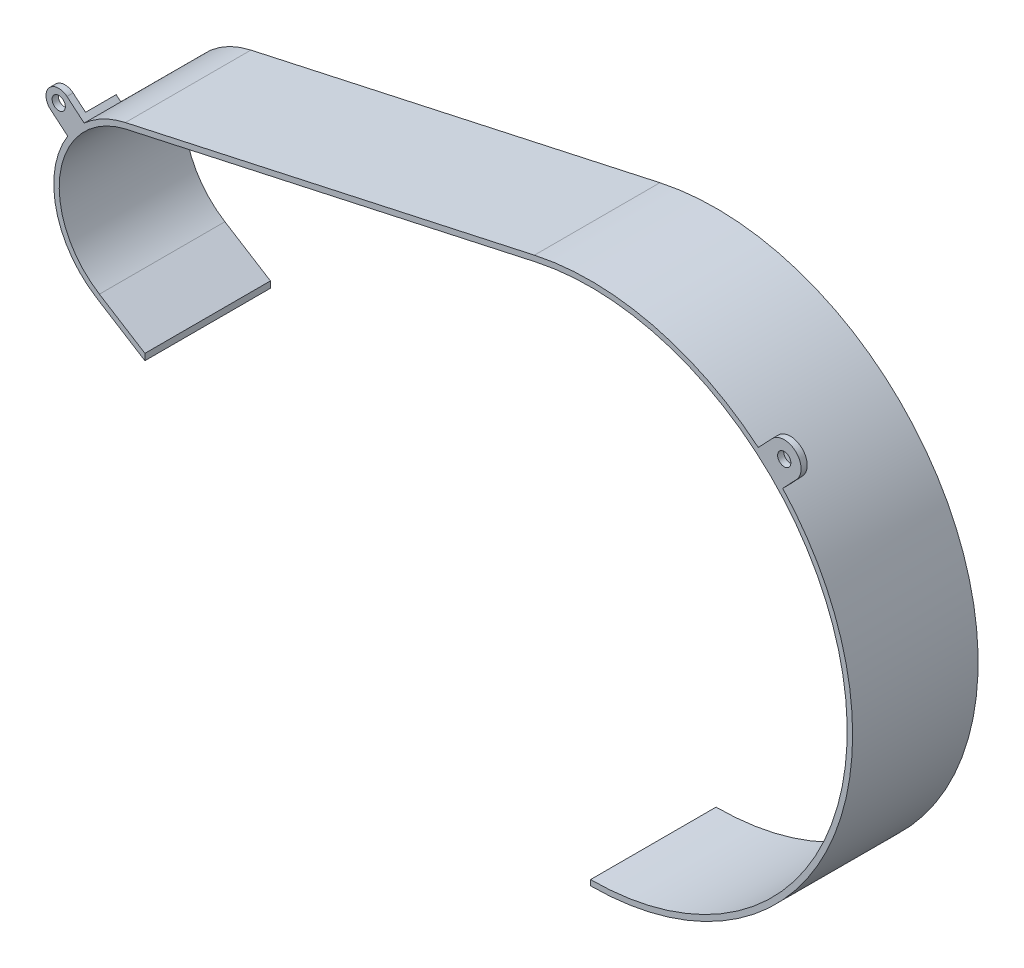
ISO-10303-21;
HEADER;
FILE_DESCRIPTION(('STEP AP214'),'2;1');
FILE_NAME('part.step','',(''),(''),'','','');
FILE_SCHEMA(('AUTOMOTIVE_DESIGN { 1 0 10303 214 1 1 1 1 }'));
ENDSEC;
DATA;
#1=APPLICATION_CONTEXT('core data for automotive mechanical design processes');
#2=APPLICATION_PROTOCOL_DEFINITION('international standard','automotive_design',2000,#1);
#3=PRODUCT_CONTEXT('',#1,'mechanical');
#4=PRODUCT('Part','Part','',(#3));
#5=PRODUCT_RELATED_PRODUCT_CATEGORY('part','',(#4));
#6=PRODUCT_DEFINITION_FORMATION('','',#4);
#7=PRODUCT_DEFINITION_CONTEXT('part definition',#1,'design');
#8=PRODUCT_DEFINITION('design','',#6,#7);
#9=PRODUCT_DEFINITION_SHAPE('','',#8);
#10=(LENGTH_UNIT() NAMED_UNIT(*) SI_UNIT(.MILLI.,.METRE.));
#11=(NAMED_UNIT(*) PLANE_ANGLE_UNIT() SI_UNIT($,.RADIAN.));
#12=(NAMED_UNIT(*) SI_UNIT($,.STERADIAN.) SOLID_ANGLE_UNIT());
#13=UNCERTAINTY_MEASURE_WITH_UNIT(LENGTH_MEASURE(1.E-05),#10,'distance_accuracy_value','');
#14=(GEOMETRIC_REPRESENTATION_CONTEXT(3) GLOBAL_UNCERTAINTY_ASSIGNED_CONTEXT((#13)) GLOBAL_UNIT_ASSIGNED_CONTEXT((#10,
#11,#12)) REPRESENTATION_CONTEXT('',''));
#15=CARTESIAN_POINT('',(0.,0.,0.));
#16=DIRECTION('',(0.,0.,1.));
#17=DIRECTION('',(1.,0.,0.));
#18=AXIS2_PLACEMENT_3D('',#15,#16,#17);
#19=CARTESIAN_POINT('',(-0.694427294768429,68.7178075815896,529.75642530509));
#20=DIRECTION('',(0.,0.,-1.));
#21=DIRECTION('',(-1.,0.,0.));
#22=AXIS2_PLACEMENT_3D('',#19,#20,#21);
#23=CYLINDRICAL_SURFACE('',#22,44.6599999999996);
#24=CARTESIAN_POINT('',(-0.694427294768429,68.7178075815896,43.5));
#25=DIRECTION('',(0.,0.,-1.));
#26=DIRECTION('',(-1.,0.,0.));
#27=AXIS2_PLACEMENT_3D('',#24,#25,#26);
#28=CIRCLE('',#27,44.6599999999996);
#29=CARTESIAN_POINT('',(-38.5377536434611,92.4327448757574,43.5));
#30=VERTEX_POINT('',#29);
#31=CARTESIAN_POINT('',(-30.4831205853251,101.991661461793,43.5));
#32=VERTEX_POINT('',#31);
#33=EDGE_CURVE('E11',#30,#32,#28,.T.);
#34=ORIENTED_EDGE('',*,*,#33,.T.);
#35=DIRECTION('',(0.,0.,1.));
#36=VECTOR('',#35,1.);
#37=CARTESIAN_POINT('',(-30.4831205853251,101.991661461793,58.5));
#38=LINE('',#37,#36);
#39=CARTESIAN_POINT('',(-30.4831205853251,101.991661461793,61.5));
#40=VERTEX_POINT('',#39);
#41=EDGE_CURVE('E255',#32,#40,#38,.T.);
#42=ORIENTED_EDGE('',*,*,#41,.T.);
#43=CARTESIAN_POINT('',(-0.694427294768429,68.7178075815896,61.5));
#44=DIRECTION('',(0.,0.,1.));
#45=DIRECTION('',(1.,0.,0.));
#46=AXIS2_PLACEMENT_3D('',#43,#44,#45);
#47=CIRCLE('',#46,44.6599999999996);
#48=CARTESIAN_POINT('',(-10.2551318378625,112.342439713446,61.5));
#49=VERTEX_POINT('',#48);
#50=EDGE_CURVE('E289',#49,#40,#47,.T.);
#51=ORIENTED_EDGE('',*,*,#50,.F.);
#52=DIRECTION('',(0.,0.,-1.));
#53=VECTOR('',#52,1.);
#54=CARTESIAN_POINT('',(-10.2551318378625,112.342439713446,529.75642530509));
#55=LINE('',#54,#53);
#56=CARTESIAN_POINT('',(-10.2551318378625,112.342439713446,0.));
#57=VERTEX_POINT('',#56);
#58=EDGE_CURVE('E330',#49,#57,#55,.T.);
#59=ORIENTED_EDGE('',*,*,#58,.T.);
#60=CARTESIAN_POINT('',(-0.694427294768429,68.7178075815896,0.));
#61=DIRECTION('',(0.,0.,1.));
#62=DIRECTION('',(1.,0.,0.));
#63=AXIS2_PLACEMENT_3D('',#60,#61,#62);
#64=CIRCLE('',#63,44.6599999999996);
#65=CARTESIAN_POINT('',(-24.4006210796191,30.8690034230026,0.));
#66=VERTEX_POINT('',#65);
#67=EDGE_CURVE('E322',#57,#66,#64,.T.);
#68=ORIENTED_EDGE('',*,*,#67,.T.);
#69=DIRECTION('',(0.,0.,-1.));
#70=VECTOR('',#69,1.);
#71=CARTESIAN_POINT('',(-24.4006210796191,30.8690034230026,529.75642530509));
#72=LINE('',#71,#70);
#73=CARTESIAN_POINT('',(-24.4006210796191,30.8690034230026,61.5));
#74=VERTEX_POINT('',#73);
#75=EDGE_CURVE('E328',#74,#66,#72,.T.);
#76=ORIENTED_EDGE('',*,*,#75,.F.);
#77=CARTESIAN_POINT('',(-38.5377536434611,92.4327448757574,61.5));
#78=VERTEX_POINT('',#77);
#79=EDGE_CURVE('E288',#78,#74,#47,.T.);
#80=ORIENTED_EDGE('',*,*,#79,.F.);
#81=DIRECTION('',(0.,0.,1.));
#82=VECTOR('',#81,1.);
#83=CARTESIAN_POINT('',(-38.5377536434611,92.4327448757574,58.5));
#84=LINE('',#83,#82);
#85=EDGE_CURVE('E258',#30,#78,#84,.T.);
#86=ORIENTED_EDGE('',*,*,#85,.F.);
#87=EDGE_LOOP('',(#34,#42,#51,#59,#68,#76,#80,#86));
#88=FACE_BOUND('',#87,.T.);
#89=ADVANCED_FACE('F37',(#88),#23,.T.);
#90=CARTESIAN_POINT('',(-42.9201771884048,104.298505240855,58.5));
#91=DIRECTION('',(0.,0.,-1.));
#92=DIRECTION('',(-1.,0.,0.));
#93=AXIS2_PLACEMENT_3D('',#90,#91,#92);
#94=PLANE('',#93);
#95=CARTESIAN_POINT('',(-42.9201771884048,104.298505240855,58.5));
#96=DIRECTION('',(0.,0.,1.));
#97=DIRECTION('',(1.,0.,0.));
#98=AXIS2_PLACEMENT_3D('',#95,#96,#97);
#99=CIRCLE('',#98,3.24999999999824);
#100=CARTESIAN_POINT('',(-39.6701771884066,104.298505240855,58.5));
#101=VERTEX_POINT('',#100);
#102=EDGE_CURVE('E230',#101,#101,#99,.T.);
#103=ORIENTED_EDGE('',*,*,#102,.T.);
#104=EDGE_LOOP('',(#103));
#105=FACE_BOUND('',#104,.T.);
#106=DIRECTION('',(-0.764713326882832,0.64437064465088,0.));
#107=VECTOR('',#106,1.);
#108=CARTESIAN_POINT('',(-38.8928606593368,109.077963533873,58.5));
#109=LINE('',#108,#107);
#110=CARTESIAN_POINT('',(-32.7772605659736,103.924773395745,58.5));
#111=VERTEX_POINT('',#110);
#112=CARTESIAN_POINT('',(-38.8928606593368,109.077963533873,58.5));
#113=VERTEX_POINT('',#112);
#114=EDGE_CURVE('E243',#111,#113,#109,.T.);
#115=ORIENTED_EDGE('',*,*,#114,.F.);
#116=DIRECTION('',(0.64437064465088,0.764713326882832,0.));
#117=VECTOR('',#116,1.);
#118=CARTESIAN_POINT('',(-32.7772605659736,103.924773395745,58.5));
#119=LINE('',#118,#117);
#120=CARTESIAN_POINT('',(-40.8318936241096,94.3658568097101,58.5));
#121=VERTEX_POINT('',#120);
#122=EDGE_CURVE('E212',#121,#111,#119,.T.);
#123=ORIENTED_EDGE('',*,*,#122,.F.);
#124=DIRECTION('',(0.764713326882832,-0.64437064465088,0.));
#125=VECTOR('',#124,1.);
#126=CARTESIAN_POINT('',(-46.9474937174728,99.5190469478378,58.5));
#127=LINE('',#126,#125);
#128=CARTESIAN_POINT('',(-46.9474937174728,99.5190469478378,58.5));
#129=VERTEX_POINT('',#128);
#130=EDGE_CURVE('E239',#129,#121,#127,.T.);
#131=ORIENTED_EDGE('',*,*,#130,.F.);
#132=CARTESIAN_POINT('',(-42.9201771884048,104.298505240855,58.5));
#133=DIRECTION('',(0.,0.,1.));
#134=DIRECTION('',(-1.,0.,0.));
#135=AXIS2_PLACEMENT_3D('',#132,#133,#134);
#136=CIRCLE('',#135,6.25);
#137=EDGE_CURVE('E236',#113,#129,#136,.T.);
#138=ORIENTED_EDGE('',*,*,#137,.F.);
#139=EDGE_LOOP('',(#115,#123,#131,#138));
#140=FACE_BOUND('',#139,.T.);
#141=ADVANCED_FACE('F392',(#105,#140),#94,.T.);
#142=CARTESIAN_POINT('',(-24.4006210796182,30.8690034230041,529.75642530509));
#143=DIRECTION('',(0.530814907856048,0.847487777845661,0.));
#144=DIRECTION('',(-0.84748777784566,0.530814907856048,0.));
#145=AXIS2_PLACEMENT_3D('',#142,#143,#144);
#146=PLANE('',#145);
#147=DIRECTION('',(0.,0.,-1.));
#148=VECTOR('',#147,1.);
#149=CARTESIAN_POINT('',(-0.694427294768426,16.020882425306,529.75642530509));
#150=LINE('',#149,#148);
#151=CARTESIAN_POINT('',(-0.694427294768425,16.020882425306,61.5));
#152=VERTEX_POINT('',#151);
#153=CARTESIAN_POINT('',(-0.694427294768425,16.020882425306,0.));
#154=VERTEX_POINT('',#153);
#155=EDGE_CURVE('E275',#152,#154,#150,.T.);
#156=ORIENTED_EDGE('',*,*,#155,.F.);
#157=DIRECTION('',(0.84748777784566,-0.530814907856048,0.));
#158=VECTOR('',#157,1.);
#159=CARTESIAN_POINT('',(-24.4006210796182,30.8690034230041,61.5));
#160=LINE('',#159,#158);
#161=EDGE_CURVE('E285',#74,#152,#160,.T.);
#162=ORIENTED_EDGE('',*,*,#161,.F.);
#163=ORIENTED_EDGE('',*,*,#75,.T.);
#164=DIRECTION('',(0.84748777784566,-0.530814907856048,0.));
#165=VECTOR('',#164,1.);
#166=CARTESIAN_POINT('',(-24.4006210796182,30.8690034230041,0.));
#167=LINE('',#166,#165);
#168=EDGE_CURVE('E325',#66,#154,#167,.T.);
#169=ORIENTED_EDGE('',*,*,#168,.T.);
#170=EDGE_LOOP('',(#156,#162,#163,#169));
#171=FACE_BOUND('',#170,.T.);
#172=ADVANCED_FACE('F398',(#171),#146,.F.);
#173=CARTESIAN_POINT('',(217.691145813398,30.8015134419438,0.));
#174=DIRECTION('',(0.,0.,1.));
#175=DIRECTION('',(1.,0.,0.));
#176=AXIS2_PLACEMENT_3D('',#173,#174,#175);
#177=PLANE('',#176);
#178=DIRECTION('',(0.,1.,0.));
#179=VECTOR('',#178,1.);
#180=CARTESIAN_POINT('',(-0.694427294768425,0.,0.));
#181=LINE('',#180,#179);
#182=CARTESIAN_POINT('',(-0.694427294768422,19.1595707574986,0.));
#183=VERTEX_POINT('',#182);
#184=EDGE_CURVE('E262',#154,#183,#181,.T.);
#185=ORIENTED_EDGE('',*,*,#184,.F.);
#186=ORIENTED_EDGE('',*,*,#168,.F.);
#187=ORIENTED_EDGE('',*,*,#67,.F.);
#188=DIRECTION('',(-0.976816662155274,-0.214077575976161,0.));
#189=VECTOR('',#188,1.);
#190=CARTESIAN_POINT('',(190.193154769985,156.272365325998,0.));
#191=LINE('',#190,#189);
#192=CARTESIAN_POINT('',(190.193154769985,156.272365325998,0.));
#193=VERTEX_POINT('',#192);
#194=EDGE_CURVE('E319',#193,#57,#191,.T.);
#195=ORIENTED_EDGE('',*,*,#194,.F.);
#196=CARTESIAN_POINT('',(217.691145813398,30.8015134419438,0.));
#197=DIRECTION('',(0.,0.,1.));
#198=DIRECTION('',(1.,0.,0.));
#199=AXIS2_PLACEMENT_3D('',#196,#197,#198);
#200=CIRCLE('',#199,128.448722001949);
#201=CARTESIAN_POINT('',(217.69114570248,-97.6472085600048,0.));
#202=VERTEX_POINT('',#201);
#203=EDGE_CURVE('E317',#202,#193,#200,.T.);
#204=ORIENTED_EDGE('',*,*,#203,.F.);
#205=DIRECTION('',(0.,1.,0.));
#206=VECTOR('',#205,1.);
#207=CARTESIAN_POINT('',(217.69114570248,0.,0.));
#208=LINE('',#207,#206);
#209=CARTESIAN_POINT('',(217.69114570248,-94.9872085600048,0.));
#210=VERTEX_POINT('',#209);
#211=EDGE_CURVE('E264',#202,#210,#208,.T.);
#212=ORIENTED_EDGE('',*,*,#211,.T.);
#213=CARTESIAN_POINT('',(217.691145813398,30.8015134419438,0.));
#214=DIRECTION('',(0.,0.,1.));
#215=DIRECTION('',(1.,0.,0.));
#216=AXIS2_PLACEMENT_3D('',#213,#214,#215);
#217=CIRCLE('',#216,125.788722001949);
#218=CARTESIAN_POINT('',(190.762601122082,153.674033004665,0.));
#219=VERTEX_POINT('',#218);
#220=EDGE_CURVE('E305',#210,#219,#217,.T.);
#221=ORIENTED_EDGE('',*,*,#220,.T.);
#222=DIRECTION('',(-0.976816662155274,-0.214077575976161,0.));
#223=VECTOR('',#222,1.);
#224=CARTESIAN_POINT('',(190.762601122082,153.674033004665,0.));
#225=LINE('',#224,#223);
#226=CARTESIAN_POINT('',(-9.68568548576584,109.744107392113,0.));
#227=VERTEX_POINT('',#226);
#228=EDGE_CURVE('E307',#219,#227,#225,.T.);
#229=ORIENTED_EDGE('',*,*,#228,.T.);
#230=CARTESIAN_POINT('',(-0.694427294768429,68.7178075815896,0.));
#231=DIRECTION('',(0.,0.,1.));
#232=DIRECTION('',(1.,0.,0.));
#233=AXIS2_PLACEMENT_3D('',#230,#231,#232);
#234=CIRCLE('',#233,41.9999999999996);
#235=CARTESIAN_POINT('',(-22.9886534247211,33.1233209120736,0.));
#236=VERTEX_POINT('',#235);
#237=EDGE_CURVE('E299',#227,#236,#234,.T.);
#238=ORIENTED_EDGE('',*,*,#237,.T.);
#239=DIRECTION('',(0.84748777784566,-0.530814907856048,0.));
#240=VECTOR('',#239,1.);
#241=CARTESIAN_POINT('',(-22.9886534247211,33.1233209120736,0.));
#242=LINE('',#241,#240);
#243=EDGE_CURVE('E302',#236,#183,#242,.T.);
#244=ORIENTED_EDGE('',*,*,#243,.T.);
#245=EDGE_LOOP('',(#185,#186,#187,#195,#204,#212,#221,#229,#238,#244));
#246=FACE_BOUND('',#245,.T.);
#247=ADVANCED_FACE('F368',(#246),#177,.F.);
#248=CARTESIAN_POINT('',(-22.9886534247211,33.1233209120736,529.75642530509));
#249=DIRECTION('',(0.530814907856048,0.84748777784566,0.));
#250=DIRECTION('',(-0.84748777784566,0.530814907856048,0.));
#251=AXIS2_PLACEMENT_3D('',#248,#249,#250);
#252=PLANE('',#251);
#253=DIRECTION('',(0.84748777784566,-0.530814907856048,0.));
#254=VECTOR('',#253,1.);
#255=CARTESIAN_POINT('',(-22.9886534247211,33.1233209120736,61.5));
#256=LINE('',#255,#254);
#257=CARTESIAN_POINT('',(-22.9886534247211,33.1233209120736,61.5));
#258=VERTEX_POINT('',#257);
#259=CARTESIAN_POINT('',(-0.694427294768425,19.1595707574986,61.5));
#260=VERTEX_POINT('',#259);
#261=EDGE_CURVE('E279',#258,#260,#256,.T.);
#262=ORIENTED_EDGE('',*,*,#261,.T.);
#263=DIRECTION('',(0.,0.,-1.));
#264=VECTOR('',#263,1.);
#265=CARTESIAN_POINT('',(-0.694427294768426,19.1595707574986,529.75642530509));
#266=LINE('',#265,#264);
#267=EDGE_CURVE('E272',#260,#183,#266,.T.);
#268=ORIENTED_EDGE('',*,*,#267,.T.);
#269=ORIENTED_EDGE('',*,*,#243,.F.);
#270=DIRECTION('',(0.,0.,-1.));
#271=VECTOR('',#270,1.);
#272=CARTESIAN_POINT('',(-22.9886534247211,33.1233209120736,529.75642530509));
#273=LINE('',#272,#271);
#274=EDGE_CURVE('E315',#258,#236,#273,.T.);
#275=ORIENTED_EDGE('',*,*,#274,.F.);
#276=EDGE_LOOP('',(#262,#268,#269,#275));
#277=FACE_BOUND('',#276,.T.);
#278=ADVANCED_FACE('F345',(#277),#252,.T.);
#279=CARTESIAN_POINT('',(0.,0.,61.5));
#280=DIRECTION('',(0.,0.,1.));
#281=DIRECTION('',(1.,0.,0.));
#282=AXIS2_PLACEMENT_3D('',#279,#280,#281);
#283=PLANE('',#282);
#284=ORIENTED_EDGE('',*,*,#161,.T.);
#285=DIRECTION('',(0.,1.,0.));
#286=VECTOR('',#285,1.);
#287=CARTESIAN_POINT('',(-0.694427294768425,0.,61.5));
#288=LINE('',#287,#286);
#289=EDGE_CURVE('E45',#152,#260,#288,.T.);
#290=ORIENTED_EDGE('',*,*,#289,.T.);
#291=ORIENTED_EDGE('',*,*,#261,.F.);
#292=CARTESIAN_POINT('',(-0.694427294768429,68.7178075815896,61.5));
#293=DIRECTION('',(0.,0.,1.));
#294=DIRECTION('',(1.,0.,0.));
#295=AXIS2_PLACEMENT_3D('',#292,#293,#294);
#296=CIRCLE('',#295,41.9999999999996);
#297=CARTESIAN_POINT('',(-9.68568548576584,109.744107392113,61.5));
#298=VERTEX_POINT('',#297);
#299=EDGE_CURVE('E282',#298,#258,#296,.T.);
#300=ORIENTED_EDGE('',*,*,#299,.F.);
#301=DIRECTION('',(-0.976816662155274,-0.214077575976161,0.));
#302=VECTOR('',#301,1.);
#303=CARTESIAN_POINT('',(190.762601122082,153.674033004665,61.5));
#304=LINE('',#303,#302);
#305=CARTESIAN_POINT('',(190.762601122082,153.674033004665,61.5));
#306=VERTEX_POINT('',#305);
#307=EDGE_CURVE('E335',#306,#298,#304,.T.);
#308=ORIENTED_EDGE('',*,*,#307,.F.);
#309=CARTESIAN_POINT('',(217.691145813398,30.8015134419438,61.5));
#310=DIRECTION('',(0.,0.,1.));
#311=DIRECTION('',(1.,0.,0.));
#312=AXIS2_PLACEMENT_3D('',#309,#310,#311);
#313=CIRCLE('',#312,125.788722001949);
#314=CARTESIAN_POINT('',(217.69114570248,-94.9872085600048,61.5));
#315=VERTEX_POINT('',#314);
#316=EDGE_CURVE('E277',#315,#306,#313,.T.);
#317=ORIENTED_EDGE('',*,*,#316,.F.);
#318=DIRECTION('',(0.,1.,0.));
#319=VECTOR('',#318,1.);
#320=CARTESIAN_POINT('',(217.69114570248,0.,61.5));
#321=LINE('',#320,#319);
#322=CARTESIAN_POINT('',(217.691145813398,-97.6472085600048,61.5));
#323=VERTEX_POINT('',#322);
#324=EDGE_CURVE('E254',#323,#315,#321,.T.);
#325=ORIENTED_EDGE('',*,*,#324,.F.);
#326=CARTESIAN_POINT('',(217.691145813398,30.8015134419438,61.5));
#327=DIRECTION('',(0.,0.,1.));
#328=DIRECTION('',(1.,0.,0.));
#329=AXIS2_PLACEMENT_3D('',#326,#327,#328);
#330=CIRCLE('',#329,128.448722001949);
#331=CARTESIAN_POINT('',(311.872256696592,118.145617631874,61.5));
#332=VERTEX_POINT('',#331);
#333=EDGE_CURVE('E296',#323,#332,#330,.T.);
#334=ORIENTED_EDGE('',*,*,#333,.T.);
#335=DIRECTION('',(0.688031108885611,0.725681192539559,0.));
#336=VECTOR('',#335,1.);
#337=CARTESIAN_POINT('',(318.602174778539,125.243806821766,61.5));
#338=LINE('',#337,#336);
#339=CARTESIAN_POINT('',(318.602174778539,125.243806821766,61.5));
#340=VERTEX_POINT('',#339);
#341=EDGE_CURVE('E197',#332,#340,#338,.T.);
#342=ORIENTED_EDGE('',*,*,#341,.T.);
#343=CARTESIAN_POINT('',(312.615304940089,130.920063470071,61.5));
#344=DIRECTION('',(0.,0.,1.));
#345=DIRECTION('',(-1.,0.,0.));
#346=AXIS2_PLACEMENT_3D('',#343,#344,#345);
#347=CIRCLE('',#346,8.24999999999829);
#348=CARTESIAN_POINT('',(306.628435101639,136.596320118376,61.5));
#349=VERTEX_POINT('',#348);
#350=EDGE_CURVE('E207',#340,#349,#347,.T.);
#351=ORIENTED_EDGE('',*,*,#350,.T.);
#352=DIRECTION('',(-0.688031108885604,-0.725681192539565,0.));
#353=VECTOR('',#352,1.);
#354=CARTESIAN_POINT('',(306.628435101639,136.596320118376,61.5));
#355=LINE('',#354,#353);
#356=CARTESIAN_POINT('',(299.898517019691,129.498130928485,61.5));
#357=VERTEX_POINT('',#356);
#358=EDGE_CURVE('E52',#349,#357,#355,.T.);
#359=ORIENTED_EDGE('',*,*,#358,.T.);
#360=CARTESIAN_POINT('',(190.193154769985,156.272365325998,61.5));
#361=VERTEX_POINT('',#360);
#362=EDGE_CURVE('E295',#357,#361,#330,.T.);
#363=ORIENTED_EDGE('',*,*,#362,.T.);
#364=DIRECTION('',(-0.976816662155274,-0.214077575976161,0.));
#365=VECTOR('',#364,1.);
#366=CARTESIAN_POINT('',(190.193154769985,156.272365325998,61.5));
#367=LINE('',#366,#365);
#368=EDGE_CURVE('E292',#361,#49,#367,.T.);
#369=ORIENTED_EDGE('',*,*,#368,.T.);
#370=ORIENTED_EDGE('',*,*,#50,.T.);
#371=DIRECTION('',(-0.764713326882832,0.64437064465088,0.));
#372=VECTOR('',#371,1.);
#373=CARTESIAN_POINT('',(-38.8928606593368,109.077963533873,61.5));
#374=LINE('',#373,#372);
#375=CARTESIAN_POINT('',(-38.8928606593368,109.077963533873,61.5));
#376=VERTEX_POINT('',#375);
#377=EDGE_CURVE('E240',#40,#376,#374,.T.);
#378=ORIENTED_EDGE('',*,*,#377,.T.);
#379=CARTESIAN_POINT('',(-42.9201771884048,104.298505240855,61.5));
#380=DIRECTION('',(0.,0.,1.));
#381=DIRECTION('',(-1.,0.,0.));
#382=AXIS2_PLACEMENT_3D('',#379,#380,#381);
#383=CIRCLE('',#382,6.25);
#384=CARTESIAN_POINT('',(-46.9474937174728,99.5190469478378,61.5));
#385=VERTEX_POINT('',#384);
#386=EDGE_CURVE('E233',#376,#385,#383,.T.);
#387=ORIENTED_EDGE('',*,*,#386,.T.);
#388=DIRECTION('',(0.764713326882832,-0.64437064465088,0.));
#389=VECTOR('',#388,1.);
#390=CARTESIAN_POINT('',(-46.9474937174728,99.5190469478378,61.5));
#391=LINE('',#390,#389);
#392=EDGE_CURVE('E248',#385,#78,#391,.T.);
#393=ORIENTED_EDGE('',*,*,#392,.T.);
#394=ORIENTED_EDGE('',*,*,#79,.T.);
#395=EDGE_LOOP('',(#284,#290,#291,#300,#308,#317,#325,#334,#342,#351,#359,#363,#369,#370,#378,
#387,#393,#394));
#396=FACE_BOUND('',#395,.T.);
#397=CARTESIAN_POINT('',(-42.9201771884048,104.298505240855,61.5));
#398=DIRECTION('',(0.,0.,1.));
#399=DIRECTION('',(1.,0.,0.));
#400=AXIS2_PLACEMENT_3D('',#397,#398,#399);
#401=CIRCLE('',#400,3.24999999999824);
#402=CARTESIAN_POINT('',(-39.6701771884066,104.298505240855,61.5));
#403=VERTEX_POINT('',#402);
#404=EDGE_CURVE('E229',#403,#403,#401,.T.);
#405=ORIENTED_EDGE('',*,*,#404,.F.);
#406=EDGE_LOOP('',(#405));
#407=FACE_BOUND('',#406,.T.);
#408=CARTESIAN_POINT('',(312.615304940089,130.920063470071,61.5));
#409=DIRECTION('',(0.,0.,1.));
#410=DIRECTION('',(1.,0.,0.));
#411=AXIS2_PLACEMENT_3D('',#408,#409,#410);
#412=CIRCLE('',#411,3.24999999999827);
#413=CARTESIAN_POINT('',(315.865304940087,130.920063470071,61.5));
#414=VERTEX_POINT('',#413);
#415=EDGE_CURVE('E202',#414,#414,#412,.T.);
#416=ORIENTED_EDGE('',*,*,#415,.F.);
#417=EDGE_LOOP('',(#416));
#418=FACE_BOUND('',#417,.T.);
#419=ADVANCED_FACE('F338',(#396,#407,#418),#283,.T.);
#420=CARTESIAN_POINT('',(190.193154769985,156.272365325998,529.75642530509));
#421=DIRECTION('',(0.214077575976161,-0.976816662155274,0.));
#422=DIRECTION('',(0.976816662155274,0.214077575976161,0.));
#423=AXIS2_PLACEMENT_3D('',#420,#421,#422);
#424=PLANE('',#423);
#425=ORIENTED_EDGE('',*,*,#368,.F.);
#426=DIRECTION('',(0.,0.,-1.));
#427=VECTOR('',#426,1.);
#428=CARTESIAN_POINT('',(190.193154769985,156.272365325998,529.75642530509));
#429=LINE('',#428,#427);
#430=EDGE_CURVE('E332',#361,#193,#429,.T.);
#431=ORIENTED_EDGE('',*,*,#430,.T.);
#432=ORIENTED_EDGE('',*,*,#194,.T.);
#433=ORIENTED_EDGE('',*,*,#58,.F.);
#434=EDGE_LOOP('',(#425,#431,#432,#433));
#435=FACE_BOUND('',#434,.T.);
#436=ADVANCED_FACE('F377',(#435),#424,.F.);
#437=CARTESIAN_POINT('',(217.691145813398,30.8015134419438,529.75642530509));
#438=DIRECTION('',(0.,0.,-1.));
#439=DIRECTION('',(-1.,0.,0.));
#440=AXIS2_PLACEMENT_3D('',#437,#438,#439);
#441=CYLINDRICAL_SURFACE('',#440,128.448722001949);
#442=CARTESIAN_POINT('',(217.691145813398,30.8015134419438,58.5));
#443=DIRECTION('',(0.,0.,-1.));
#444=DIRECTION('',(-1.,0.,0.));
#445=AXIS2_PLACEMENT_3D('',#442,#443,#444);
#446=CIRCLE('',#445,128.448722001949);
#447=CARTESIAN_POINT('',(299.898517019691,129.498130928485,58.5));
#448=VERTEX_POINT('',#447);
#449=CARTESIAN_POINT('',(311.872256696592,118.145617631874,58.5));
#450=VERTEX_POINT('',#449);
#451=EDGE_CURVE('E193',#448,#450,#446,.T.);
#452=ORIENTED_EDGE('',*,*,#451,.T.);
#453=DIRECTION('',(0.,0.,1.));
#454=VECTOR('',#453,1.);
#455=CARTESIAN_POINT('',(311.872256696592,118.145617631874,58.5));
#456=LINE('',#455,#454);
#457=EDGE_CURVE('E213',#450,#332,#456,.T.);
#458=ORIENTED_EDGE('',*,*,#457,.T.);
#459=ORIENTED_EDGE('',*,*,#333,.F.);
#460=DIRECTION('',(0.,0.,1.));
#461=VECTOR('',#460,1.);
#462=CARTESIAN_POINT('',(217.69114570248,-97.6472085600048,0.));
#463=LINE('',#462,#461);
#464=EDGE_CURVE('E267',#202,#323,#463,.T.);
#465=ORIENTED_EDGE('',*,*,#464,.F.);
#466=ORIENTED_EDGE('',*,*,#203,.T.);
#467=ORIENTED_EDGE('',*,*,#430,.F.);
#468=ORIENTED_EDGE('',*,*,#362,.F.);
#469=DIRECTION('',(0.,0.,1.));
#470=VECTOR('',#469,1.);
#471=CARTESIAN_POINT('',(299.898517019691,129.498130928485,58.5));
#472=LINE('',#471,#470);
#473=EDGE_CURVE('E183',#448,#357,#472,.T.);
#474=ORIENTED_EDGE('',*,*,#473,.F.);
#475=EDGE_LOOP('',(#452,#458,#459,#465,#466,#467,#468,#474));
#476=FACE_BOUND('',#475,.T.);
#477=ADVANCED_FACE('F39',(#476),#441,.T.);
#478=CARTESIAN_POINT('',(190.762601122082,153.674033004665,529.75642530509));
#479=DIRECTION('',(0.214077575976161,-0.976816662155274,0.));
#480=DIRECTION('',(0.976816662155274,0.214077575976161,0.));
#481=AXIS2_PLACEMENT_3D('',#478,#479,#480);
#482=PLANE('',#481);
#483=DIRECTION('',(0.,0.,-1.));
#484=VECTOR('',#483,1.);
#485=CARTESIAN_POINT('',(190.762601122082,153.674033004665,529.75642530509));
#486=LINE('',#485,#484);
#487=EDGE_CURVE('E312',#306,#219,#486,.T.);
#488=ORIENTED_EDGE('',*,*,#487,.F.);
#489=ORIENTED_EDGE('',*,*,#307,.T.);
#490=DIRECTION('',(0.,0.,-1.));
#491=VECTOR('',#490,1.);
#492=CARTESIAN_POINT('',(-9.68568548576584,109.744107392113,529.75642530509));
#493=LINE('',#492,#491);
#494=EDGE_CURVE('E310',#298,#227,#493,.T.);
#495=ORIENTED_EDGE('',*,*,#494,.T.);
#496=ORIENTED_EDGE('',*,*,#228,.F.);
#497=EDGE_LOOP('',(#488,#489,#495,#496));
#498=FACE_BOUND('',#497,.T.);
#499=ADVANCED_FACE('F357',(#498),#482,.T.);
#500=CARTESIAN_POINT('',(217.691145813398,30.8015134419438,529.75642530509));
#501=DIRECTION('',(0.,0.,-1.));
#502=DIRECTION('',(-1.,0.,0.));
#503=AXIS2_PLACEMENT_3D('',#500,#501,#502);
#504=CYLINDRICAL_SURFACE('',#503,125.788722001949);
#505=DIRECTION('',(0.,0.,-1.));
#506=VECTOR('',#505,1.);
#507=CARTESIAN_POINT('',(217.69114570248,-94.9872085600048,529.75642530509));
#508=LINE('',#507,#506);
#509=EDGE_CURVE('E270',#315,#210,#508,.T.);
#510=ORIENTED_EDGE('',*,*,#509,.F.);
#511=ORIENTED_EDGE('',*,*,#316,.T.);
#512=ORIENTED_EDGE('',*,*,#487,.T.);
#513=ORIENTED_EDGE('',*,*,#220,.F.);
#514=EDGE_LOOP('',(#510,#511,#512,#513));
#515=FACE_BOUND('',#514,.T.);
#516=ADVANCED_FACE('F361',(#515),#504,.F.);
#517=CARTESIAN_POINT('',(-0.694427294768429,68.7178075815896,529.75642530509));
#518=DIRECTION('',(0.,0.,-1.));
#519=DIRECTION('',(-1.,0.,0.));
#520=AXIS2_PLACEMENT_3D('',#517,#518,#519);
#521=CYLINDRICAL_SURFACE('',#520,41.9999999999996);
#522=ORIENTED_EDGE('',*,*,#494,.F.);
#523=ORIENTED_EDGE('',*,*,#299,.T.);
#524=ORIENTED_EDGE('',*,*,#274,.T.);
#525=ORIENTED_EDGE('',*,*,#237,.F.);
#526=EDGE_LOOP('',(#522,#523,#524,#525));
#527=FACE_BOUND('',#526,.T.);
#528=ADVANCED_FACE('F350',(#527),#521,.F.);
#529=CARTESIAN_POINT('',(217.69114570248,0.,0.));
#530=DIRECTION('',(1.,0.,0.));
#531=DIRECTION('',(0.,0.,-1.));
#532=AXIS2_PLACEMENT_3D('',#529,#530,#531);
#533=PLANE('',#532);
#534=ORIENTED_EDGE('',*,*,#509,.T.);
#535=ORIENTED_EDGE('',*,*,#211,.F.);
#536=ORIENTED_EDGE('',*,*,#464,.T.);
#537=ORIENTED_EDGE('',*,*,#324,.T.);
#538=EDGE_LOOP('',(#534,#535,#536,#537));
#539=FACE_BOUND('',#538,.T.);
#540=ADVANCED_FACE('F363',(#539),#533,.F.);
#541=CARTESIAN_POINT('',(-0.694427294768425,0.,0.));
#542=DIRECTION('',(1.,0.,0.));
#543=DIRECTION('',(0.,1.,0.));
#544=AXIS2_PLACEMENT_3D('',#541,#542,#543);
#545=PLANE('',#544);
#546=ORIENTED_EDGE('',*,*,#155,.T.);
#547=ORIENTED_EDGE('',*,*,#184,.T.);
#548=ORIENTED_EDGE('',*,*,#267,.F.);
#549=ORIENTED_EDGE('',*,*,#289,.F.);
#550=EDGE_LOOP('',(#546,#547,#548,#549));
#551=FACE_BOUND('',#550,.T.);
#552=ADVANCED_FACE('F415',(#551),#545,.T.);
#553=CARTESIAN_POINT('',(-42.9201771884048,104.298505240855,58.5));
#554=DIRECTION('',(0.,0.,1.));
#555=DIRECTION('',(1.,0.,0.));
#556=AXIS2_PLACEMENT_3D('',#553,#554,#555);
#557=CYLINDRICAL_SURFACE('',#556,6.25);
#558=ORIENTED_EDGE('',*,*,#386,.F.);
#559=DIRECTION('',(0.,0.,1.));
#560=VECTOR('',#559,1.);
#561=CARTESIAN_POINT('',(-38.8928606593368,109.077963533873,58.5));
#562=LINE('',#561,#560);
#563=EDGE_CURVE('E252',#113,#376,#562,.T.);
#564=ORIENTED_EDGE('',*,*,#563,.F.);
#565=ORIENTED_EDGE('',*,*,#137,.T.);
#566=DIRECTION('',(0.,0.,1.));
#567=VECTOR('',#566,1.);
#568=CARTESIAN_POINT('',(-46.9474937174728,99.5190469478378,58.5));
#569=LINE('',#568,#567);
#570=EDGE_CURVE('E245',#129,#385,#569,.T.);
#571=ORIENTED_EDGE('',*,*,#570,.T.);
#572=EDGE_LOOP('',(#558,#564,#565,#571));
#573=FACE_BOUND('',#572,.T.);
#574=ADVANCED_FACE('F447',(#573),#557,.T.);
#575=CARTESIAN_POINT('',(-38.8928606593368,109.077963533873,58.5));
#576=DIRECTION('',(0.64437064465088,0.764713326882832,0.));
#577=DIRECTION('',(-0.764713326882832,0.644370644650881,0.));
#578=AXIS2_PLACEMENT_3D('',#575,#576,#577);
#579=PLANE('',#578);
#580=ORIENTED_EDGE('',*,*,#377,.F.);
#581=ORIENTED_EDGE('',*,*,#41,.F.);
#582=DIRECTION('',(0.764713326882832,-0.64437064465088,0.));
#583=VECTOR('',#582,1.);
#584=CARTESIAN_POINT('',(-32.7772605659736,103.924773395745,43.5));
#585=LINE('',#584,#583);
#586=CARTESIAN_POINT('',(-32.7772605659736,103.924773395745,43.5));
#587=VERTEX_POINT('',#586);
#588=EDGE_CURVE('E217',#587,#32,#585,.T.);
#589=ORIENTED_EDGE('',*,*,#588,.F.);
#590=DIRECTION('',(0.,0.,1.));
#591=VECTOR('',#590,1.);
#592=CARTESIAN_POINT('',(-32.7772605659736,103.924773395745,43.5));
#593=LINE('',#592,#591);
#594=EDGE_CURVE('E224',#587,#111,#593,.T.);
#595=ORIENTED_EDGE('',*,*,#594,.T.);
#596=ORIENTED_EDGE('',*,*,#114,.T.);
#597=ORIENTED_EDGE('',*,*,#563,.T.);
#598=EDGE_LOOP('',(#580,#581,#589,#595,#596,#597));
#599=FACE_BOUND('',#598,.T.);
#600=ADVANCED_FACE('F435',(#599),#579,.T.);
#601=CARTESIAN_POINT('',(-46.9474937174728,99.5190469478378,58.5));
#602=DIRECTION('',(-0.64437064465088,-0.764713326882832,0.));
#603=DIRECTION('',(0.764713326882832,-0.64437064465088,0.));
#604=AXIS2_PLACEMENT_3D('',#601,#602,#603);
#605=PLANE('',#604);
#606=ORIENTED_EDGE('',*,*,#392,.F.);
#607=ORIENTED_EDGE('',*,*,#570,.F.);
#608=ORIENTED_EDGE('',*,*,#130,.T.);
#609=DIRECTION('',(0.,0.,1.));
#610=VECTOR('',#609,1.);
#611=CARTESIAN_POINT('',(-40.8318936241096,94.3658568097101,43.5));
#612=LINE('',#611,#610);
#613=CARTESIAN_POINT('',(-40.8318936241096,94.3658568097101,43.5));
#614=VERTEX_POINT('',#613);
#615=EDGE_CURVE('E60',#614,#121,#612,.T.);
#616=ORIENTED_EDGE('',*,*,#615,.F.);
#617=DIRECTION('',(-0.764713326882831,0.644370644650881,0.));
#618=VECTOR('',#617,1.);
#619=CARTESIAN_POINT('',(-38.5377536434611,92.4327448757574,43.5));
#620=LINE('',#619,#618);
#621=EDGE_CURVE('E220',#30,#614,#620,.T.);
#622=ORIENTED_EDGE('',*,*,#621,.F.);
#623=ORIENTED_EDGE('',*,*,#85,.T.);
#624=EDGE_LOOP('',(#606,#607,#608,#616,#622,#623));
#625=FACE_BOUND('',#624,.T.);
#626=ADVANCED_FACE('F450',(#625),#605,.T.);
#627=CARTESIAN_POINT('',(-42.9201771884048,104.298505240855,58.5));
#628=DIRECTION('',(0.,0.,1.));
#629=DIRECTION('',(1.,0.,0.));
#630=AXIS2_PLACEMENT_3D('',#627,#628,#629);
#631=CYLINDRICAL_SURFACE('',#630,3.24999999999824);
#632=ORIENTED_EDGE('',*,*,#102,.F.);
#633=EDGE_LOOP('',(#632));
#634=FACE_BOUND('',#633,.T.);
#635=ORIENTED_EDGE('',*,*,#404,.T.);
#636=EDGE_LOOP('',(#635));
#637=FACE_BOUND('',#636,.T.);
#638=ADVANCED_FACE('F452',(#634,#637),#631,.F.);
#639=CARTESIAN_POINT('',(-32.7772605659736,103.924773395745,43.5));
#640=DIRECTION('',(0.764713326882832,-0.64437064465088,0.));
#641=DIRECTION('',(0.64437064465088,0.764713326882832,0.));
#642=AXIS2_PLACEMENT_3D('',#639,#640,#641);
#643=PLANE('',#642);
#644=ORIENTED_EDGE('',*,*,#122,.T.);
#645=ORIENTED_EDGE('',*,*,#594,.F.);
#646=DIRECTION('',(0.64437064465088,0.764713326882832,0.));
#647=VECTOR('',#646,1.);
#648=CARTESIAN_POINT('',(-32.7772605659736,103.924773395745,43.5));
#649=LINE('',#648,#647);
#650=EDGE_CURVE('E222',#614,#587,#649,.T.);
#651=ORIENTED_EDGE('',*,*,#650,.F.);
#652=ORIENTED_EDGE('',*,*,#615,.T.);
#653=EDGE_LOOP('',(#644,#645,#651,#652));
#654=FACE_BOUND('',#653,.T.);
#655=ADVANCED_FACE('F439',(#654),#643,.F.);
#656=CARTESIAN_POINT('',(0.,0.,43.5));
#657=DIRECTION('',(0.,0.,-1.));
#658=DIRECTION('',(-1.,0.,0.));
#659=AXIS2_PLACEMENT_3D('',#656,#657,#658);
#660=PLANE('',#659);
#661=ORIENTED_EDGE('',*,*,#33,.F.);
#662=ORIENTED_EDGE('',*,*,#621,.T.);
#663=ORIENTED_EDGE('',*,*,#650,.T.);
#664=ORIENTED_EDGE('',*,*,#588,.T.);
#665=EDGE_LOOP('',(#661,#662,#663,#664));
#666=FACE_BOUND('',#665,.T.);
#667=ADVANCED_FACE('F388',(#666),#660,.T.);
#668=CARTESIAN_POINT('',(312.615304940089,130.920063470071,58.5));
#669=DIRECTION('',(0.,0.,1.));
#670=DIRECTION('',(1.,0.,0.));
#671=AXIS2_PLACEMENT_3D('',#668,#669,#670);
#672=CYLINDRICAL_SURFACE('',#671,8.24999999999829);
#673=ORIENTED_EDGE('',*,*,#350,.F.);
#674=DIRECTION('',(0.,0.,1.));
#675=VECTOR('',#674,1.);
#676=CARTESIAN_POINT('',(318.602174778539,125.243806821766,58.5));
#677=LINE('',#676,#675);
#678=CARTESIAN_POINT('',(318.602174778539,125.243806821766,58.5));
#679=VERTEX_POINT('',#678);
#680=EDGE_CURVE('E196',#679,#340,#677,.T.);
#681=ORIENTED_EDGE('',*,*,#680,.F.);
#682=CARTESIAN_POINT('',(312.615304940089,130.920063470071,58.5));
#683=DIRECTION('',(0.,0.,1.));
#684=DIRECTION('',(-1.,0.,0.));
#685=AXIS2_PLACEMENT_3D('',#682,#683,#684);
#686=CIRCLE('',#685,8.24999999999829);
#687=CARTESIAN_POINT('',(306.628435101639,136.596320118376,58.5));
#688=VERTEX_POINT('',#687);
#689=EDGE_CURVE('E190',#679,#688,#686,.T.);
#690=ORIENTED_EDGE('',*,*,#689,.T.);
#691=DIRECTION('',(0.,0.,1.));
#692=VECTOR('',#691,1.);
#693=CARTESIAN_POINT('',(306.628435101639,136.596320118376,58.5));
#694=LINE('',#693,#692);
#695=EDGE_CURVE('E175',#688,#349,#694,.T.);
#696=ORIENTED_EDGE('',*,*,#695,.T.);
#697=EDGE_LOOP('',(#673,#681,#690,#696));
#698=FACE_BOUND('',#697,.T.);
#699=ADVANCED_FACE('F195',(#698),#672,.T.);
#700=CARTESIAN_POINT('',(318.602174778539,125.243806821766,58.5));
#701=DIRECTION('',(0.725681192539559,-0.688031108885611,0.));
#702=DIRECTION('',(0.688031108885611,0.725681192539559,0.));
#703=AXIS2_PLACEMENT_3D('',#700,#701,#702);
#704=PLANE('',#703);
#705=ORIENTED_EDGE('',*,*,#341,.F.);
#706=ORIENTED_EDGE('',*,*,#457,.F.);
#707=DIRECTION('',(0.688031108885611,0.725681192539559,0.));
#708=VECTOR('',#707,1.);
#709=CARTESIAN_POINT('',(318.602174778539,125.243806821766,58.5));
#710=LINE('',#709,#708);
#711=EDGE_CURVE('E184',#450,#679,#710,.T.);
#712=ORIENTED_EDGE('',*,*,#711,.T.);
#713=ORIENTED_EDGE('',*,*,#680,.T.);
#714=EDGE_LOOP('',(#705,#706,#712,#713));
#715=FACE_BOUND('',#714,.T.);
#716=ADVANCED_FACE('F380',(#715),#704,.T.);
#717=CARTESIAN_POINT('',(306.628435101639,136.596320118376,58.5));
#718=DIRECTION('',(-0.725681192539565,0.688031108885604,0.));
#719=DIRECTION('',(-0.688031108885605,-0.725681192539565,0.));
#720=AXIS2_PLACEMENT_3D('',#717,#718,#719);
#721=PLANE('',#720);
#722=ORIENTED_EDGE('',*,*,#358,.F.);
#723=ORIENTED_EDGE('',*,*,#695,.F.);
#724=DIRECTION('',(-0.688031108885604,-0.725681192539565,0.));
#725=VECTOR('',#724,1.);
#726=CARTESIAN_POINT('',(306.628435101639,136.596320118376,58.5));
#727=LINE('',#726,#725);
#728=EDGE_CURVE('E178',#688,#448,#727,.T.);
#729=ORIENTED_EDGE('',*,*,#728,.T.);
#730=ORIENTED_EDGE('',*,*,#473,.T.);
#731=EDGE_LOOP('',(#722,#723,#729,#730));
#732=FACE_BOUND('',#731,.T.);
#733=ADVANCED_FACE('F177',(#732),#721,.T.);
#734=CARTESIAN_POINT('',(312.615304940089,130.920063470071,58.5));
#735=DIRECTION('',(0.,0.,-1.));
#736=DIRECTION('',(-1.,0.,0.));
#737=AXIS2_PLACEMENT_3D('',#734,#735,#736);
#738=PLANE('',#737);
#739=CARTESIAN_POINT('',(312.615304940089,130.920063470071,58.5));
#740=DIRECTION('',(0.,0.,1.));
#741=DIRECTION('',(1.,0.,0.));
#742=AXIS2_PLACEMENT_3D('',#739,#740,#741);
#743=CIRCLE('',#742,3.24999999999827);
#744=CARTESIAN_POINT('',(315.865304940087,130.920063470071,58.5));
#745=VERTEX_POINT('',#744);
#746=EDGE_CURVE('E209',#745,#745,#743,.T.);
#747=ORIENTED_EDGE('',*,*,#746,.T.);
#748=EDGE_LOOP('',(#747));
#749=FACE_BOUND('',#748,.T.);
#750=ORIENTED_EDGE('',*,*,#689,.F.);
#751=ORIENTED_EDGE('',*,*,#711,.F.);
#752=ORIENTED_EDGE('',*,*,#451,.F.);
#753=ORIENTED_EDGE('',*,*,#728,.F.);
#754=EDGE_LOOP('',(#750,#751,#752,#753));
#755=FACE_BOUND('',#754,.T.);
#756=ADVANCED_FACE('F188',(#749,#755),#738,.T.);
#757=CARTESIAN_POINT('',(312.615304940089,130.920063470071,58.5));
#758=DIRECTION('',(0.,0.,1.));
#759=DIRECTION('',(1.,0.,0.));
#760=AXIS2_PLACEMENT_3D('',#757,#758,#759);
#761=CYLINDRICAL_SURFACE('',#760,3.24999999999827);
#762=ORIENTED_EDGE('',*,*,#746,.F.);
#763=EDGE_LOOP('',(#762));
#764=FACE_BOUND('',#763,.T.);
#765=ORIENTED_EDGE('',*,*,#415,.T.);
#766=EDGE_LOOP('',(#765));
#767=FACE_BOUND('',#766,.T.);
#768=ADVANCED_FACE('F548',(#764,#767),#761,.F.);
#769=CLOSED_SHELL('',(#89,#141,#172,#247,#278,#419,#436,#477,#499,#516,#528,#540,#552,#574,#600,
#626,#638,#655,#667,#699,#716,#733,#756,#768));
#770=MANIFOLD_SOLID_BREP('B2',#769);
#771=ADVANCED_BREP_SHAPE_REPRESENTATION('',(#18,#770),#14);
#772=SHAPE_DEFINITION_REPRESENTATION(#9,#771);
ENDSEC;
END-ISO-10303-21;
